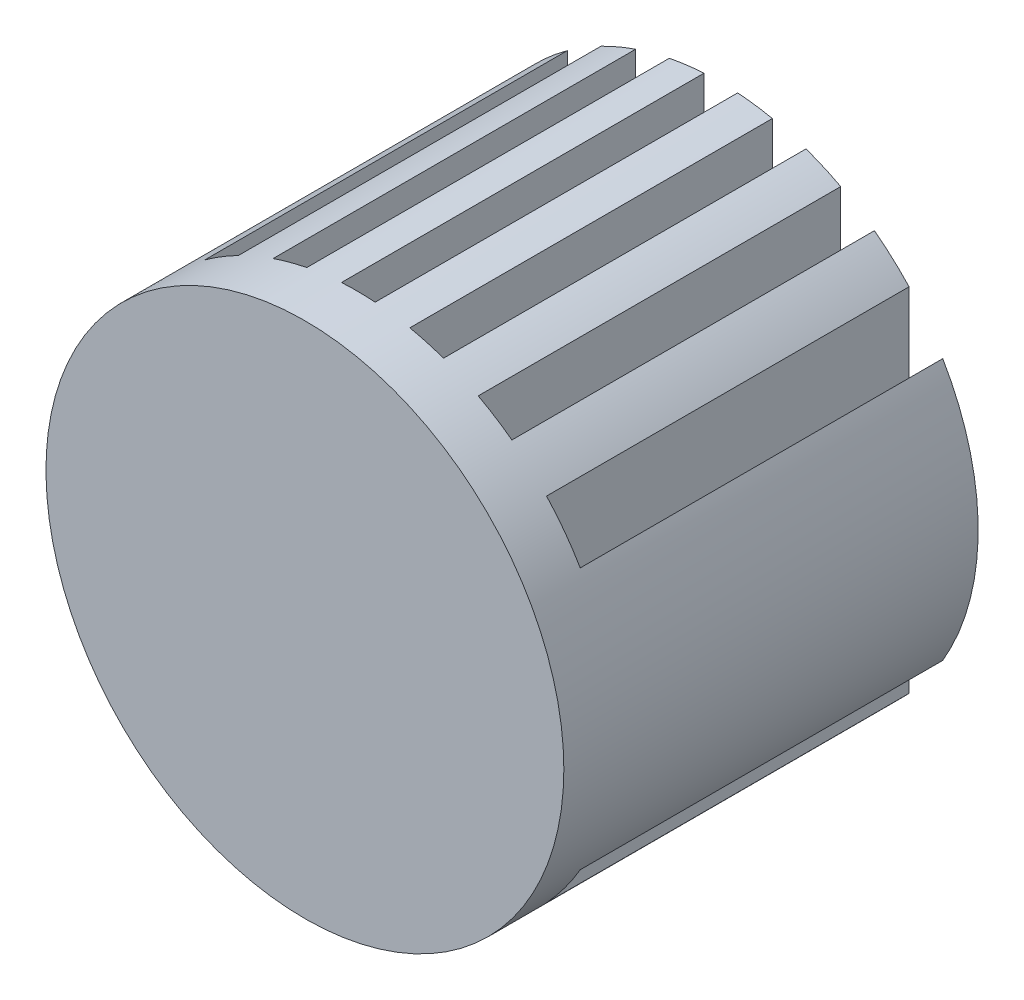
ISO-10303-21;
HEADER;
FILE_DESCRIPTION(('STEP AP214'),'2;1');
FILE_NAME('part.step','',(''),(''),'','','');
FILE_SCHEMA(('AUTOMOTIVE_DESIGN { 1 0 10303 214 1 1 1 1 }'));
ENDSEC;
DATA;
#1=APPLICATION_CONTEXT('core data for automotive mechanical design processes');
#2=APPLICATION_PROTOCOL_DEFINITION('international standard','automotive_design',2000,#1);
#3=PRODUCT_CONTEXT('',#1,'mechanical');
#4=PRODUCT('Part','Part','',(#3));
#5=PRODUCT_RELATED_PRODUCT_CATEGORY('part','',(#4));
#6=PRODUCT_DEFINITION_FORMATION('','',#4);
#7=PRODUCT_DEFINITION_CONTEXT('part definition',#1,'design');
#8=PRODUCT_DEFINITION('design','',#6,#7);
#9=PRODUCT_DEFINITION_SHAPE('','',#8);
#10=(LENGTH_UNIT() NAMED_UNIT(*) SI_UNIT(.MILLI.,.METRE.));
#11=(NAMED_UNIT(*) PLANE_ANGLE_UNIT() SI_UNIT($,.RADIAN.));
#12=(NAMED_UNIT(*) SI_UNIT($,.STERADIAN.) SOLID_ANGLE_UNIT());
#13=UNCERTAINTY_MEASURE_WITH_UNIT(LENGTH_MEASURE(1.E-05),#10,'distance_accuracy_value','');
#14=(GEOMETRIC_REPRESENTATION_CONTEXT(3) GLOBAL_UNCERTAINTY_ASSIGNED_CONTEXT((#13)) GLOBAL_UNIT_ASSIGNED_CONTEXT((#10,
#11,#12)) REPRESENTATION_CONTEXT('',''));
#15=CARTESIAN_POINT('',(0.,0.,0.));
#16=DIRECTION('',(0.,0.,1.));
#17=DIRECTION('',(1.,0.,0.));
#18=AXIS2_PLACEMENT_3D('',#15,#16,#17);
#19=CARTESIAN_POINT('',(0.,0.,0.));
#20=DIRECTION('',(0.,0.,1.));
#21=DIRECTION('',(1.,0.,0.));
#22=AXIS2_PLACEMENT_3D('',#19,#20,#21);
#23=PLANE('',#22);
#24=CARTESIAN_POINT('',(0.,0.,0.));
#25=DIRECTION('',(0.,0.,1.));
#26=DIRECTION('',(1.,0.,0.));
#27=AXIS2_PLACEMENT_3D('',#24,#25,#26);
#28=CIRCLE('',#27,31.75);
#29=CARTESIAN_POINT('',(27.40914,-16.0250286882863,0.));
#30=VERTEX_POINT('',#29);
#31=CARTESIAN_POINT('',(27.40914,16.0250286882863,0.));
#32=VERTEX_POINT('',#31);
#33=EDGE_CURVE('E261',#30,#32,#28,.T.);
#34=ORIENTED_EDGE('',*,*,#33,.F.);
#35=DIRECTION('',(0.,1.,0.));
#36=VECTOR('',#35,1.);
#37=CARTESIAN_POINT('',(27.40914,0.,0.));
#38=LINE('',#37,#36);
#39=EDGE_CURVE('E313',#30,#32,#38,.T.);
#40=ORIENTED_EDGE('',*,*,#39,.T.);
#41=EDGE_LOOP('',(#34,#40));
#42=FACE_BOUND('',#41,.T.);
#43=ADVANCED_FACE('F39',(#42),#23,.F.);
#44=CARTESIAN_POINT('',(14.8971,28.0381688344656,0.));
#45=VERTEX_POINT('',#44);
#46=CARTESIAN_POINT('',(10.64514,29.9122632774653,0.));
#47=VERTEX_POINT('',#46);
#48=EDGE_CURVE('E567',#45,#47,#28,.T.);
#49=ORIENTED_EDGE('',*,*,#48,.F.);
#50=DIRECTION('',(0.,-1.,0.));
#51=VECTOR('',#50,1.);
#52=CARTESIAN_POINT('',(14.8971,0.,0.));
#53=LINE('',#52,#51);
#54=CARTESIAN_POINT('',(14.8971,-28.0381688344656,0.));
#55=VERTEX_POINT('',#54);
#56=EDGE_CURVE('E306',#45,#55,#53,.T.);
#57=ORIENTED_EDGE('',*,*,#56,.T.);
#58=CARTESIAN_POINT('',(10.64514,-29.9122632774653,0.));
#59=VERTEX_POINT('',#58);
#60=EDGE_CURVE('E534',#59,#55,#28,.T.);
#61=ORIENTED_EDGE('',*,*,#60,.F.);
#62=DIRECTION('',(0.,1.,0.));
#63=VECTOR('',#62,1.);
#64=CARTESIAN_POINT('',(10.64514,0.,0.));
#65=LINE('',#64,#63);
#66=EDGE_CURVE('E294',#59,#47,#65,.T.);
#67=ORIENTED_EDGE('',*,*,#66,.T.);
#68=EDGE_LOOP('',(#49,#57,#61,#67));
#69=FACE_BOUND('',#68,.T.);
#70=ADVANCED_FACE('F605',(#69),#23,.F.);
#71=CARTESIAN_POINT('',(6.5151,31.074361972372,0.));
#72=VERTEX_POINT('',#71);
#73=CARTESIAN_POINT('',(2.26314,31.6692389763379,0.));
#74=VERTEX_POINT('',#73);
#75=EDGE_CURVE('E569',#72,#74,#28,.T.);
#76=ORIENTED_EDGE('',*,*,#75,.F.);
#77=DIRECTION('',(0.,-1.,0.));
#78=VECTOR('',#77,1.);
#79=CARTESIAN_POINT('',(6.51509999999999,0.,0.));
#80=LINE('',#79,#78);
#81=CARTESIAN_POINT('',(6.51509999999999,-31.074361972372,0.));
#82=VERTEX_POINT('',#81);
#83=EDGE_CURVE('E298',#72,#82,#80,.T.);
#84=ORIENTED_EDGE('',*,*,#83,.T.);
#85=CARTESIAN_POINT('',(2.26314,-31.6692389763379,0.));
#86=VERTEX_POINT('',#85);
#87=EDGE_CURVE('E537',#86,#82,#28,.T.);
#88=ORIENTED_EDGE('',*,*,#87,.F.);
#89=DIRECTION('',(0.,1.,0.));
#90=VECTOR('',#89,1.);
#91=CARTESIAN_POINT('',(2.26314,0.,0.));
#92=LINE('',#91,#90);
#93=EDGE_CURVE('E286',#86,#74,#92,.T.);
#94=ORIENTED_EDGE('',*,*,#93,.T.);
#95=EDGE_LOOP('',(#76,#84,#88,#94));
#96=FACE_BOUND('',#95,.T.);
#97=ADVANCED_FACE('F609',(#96),#23,.F.);
#98=CARTESIAN_POINT('',(-1.8669,31.6950656158021,0.));
#99=VERTEX_POINT('',#98);
#100=CARTESIAN_POINT('',(-6.11886,31.154807852086,0.));
#101=VERTEX_POINT('',#100);
#102=EDGE_CURVE('E549',#99,#101,#28,.T.);
#103=ORIENTED_EDGE('',*,*,#102,.F.);
#104=DIRECTION('',(0.,-1.,0.));
#105=VECTOR('',#104,1.);
#106=CARTESIAN_POINT('',(-1.86690000000001,0.,0.));
#107=LINE('',#106,#105);
#108=CARTESIAN_POINT('',(-1.86690000000001,-31.6950656158021,0.));
#109=VERTEX_POINT('',#108);
#110=EDGE_CURVE('E290',#99,#109,#107,.T.);
#111=ORIENTED_EDGE('',*,*,#110,.T.);
#112=CARTESIAN_POINT('',(-6.11886,-31.154807852086,0.));
#113=VERTEX_POINT('',#112);
#114=EDGE_CURVE('E260',#113,#109,#28,.T.);
#115=ORIENTED_EDGE('',*,*,#114,.F.);
#116=DIRECTION('',(0.,1.,0.));
#117=VECTOR('',#116,1.);
#118=CARTESIAN_POINT('',(-6.11886,0.,0.));
#119=LINE('',#118,#117);
#120=EDGE_CURVE('E278',#113,#101,#119,.T.);
#121=ORIENTED_EDGE('',*,*,#120,.T.);
#122=EDGE_LOOP('',(#103,#111,#115,#121));
#123=FACE_BOUND('',#122,.T.);
#124=ADVANCED_FACE('F547',(#123),#23,.F.);
#125=CARTESIAN_POINT('',(-10.2489,30.0503335886642,0.));
#126=VERTEX_POINT('',#125);
#127=CARTESIAN_POINT('',(-14.50086,28.2451333730326,0.));
#128=VERTEX_POINT('',#127);
#129=EDGE_CURVE('E572',#126,#128,#28,.T.);
#130=ORIENTED_EDGE('',*,*,#129,.F.);
#131=DIRECTION('',(0.,-1.,0.));
#132=VECTOR('',#131,1.);
#133=CARTESIAN_POINT('',(-10.2489,0.,0.));
#134=LINE('',#133,#132);
#135=CARTESIAN_POINT('',(-10.2489,-30.0503335886642,0.));
#136=VERTEX_POINT('',#135);
#137=EDGE_CURVE('E282',#126,#136,#134,.T.);
#138=ORIENTED_EDGE('',*,*,#137,.T.);
#139=CARTESIAN_POINT('',(-14.50086,-28.2451333730326,0.));
#140=VERTEX_POINT('',#139);
#141=EDGE_CURVE('E253',#140,#136,#28,.T.);
#142=ORIENTED_EDGE('',*,*,#141,.F.);
#143=DIRECTION('',(0.,1.,0.));
#144=VECTOR('',#143,1.);
#145=CARTESIAN_POINT('',(-14.50086,0.,0.));
#146=LINE('',#145,#144);
#147=EDGE_CURVE('E272',#140,#128,#146,.T.);
#148=ORIENTED_EDGE('',*,*,#147,.T.);
#149=EDGE_LOOP('',(#130,#138,#142,#148));
#150=FACE_BOUND('',#149,.T.);
#151=ADVANCED_FACE('F585',(#150),#23,.F.);
#152=CARTESIAN_POINT('',(-18.6309,25.708988023452,0.));
#153=VERTEX_POINT('',#152);
#154=CARTESIAN_POINT('',(-22.88286,22.0099345346687,0.));
#155=VERTEX_POINT('',#154);
#156=EDGE_CURVE('E258',#153,#155,#28,.T.);
#157=ORIENTED_EDGE('',*,*,#156,.F.);
#158=DIRECTION('',(0.,-1.,0.));
#159=VECTOR('',#158,1.);
#160=CARTESIAN_POINT('',(-18.6309,0.,0.));
#161=LINE('',#160,#159);
#162=CARTESIAN_POINT('',(-18.6309,-25.708988023452,0.));
#163=VERTEX_POINT('',#162);
#164=EDGE_CURVE('E250',#153,#163,#161,.T.);
#165=ORIENTED_EDGE('',*,*,#164,.T.);
#166=CARTESIAN_POINT('',(-22.88286,-22.0099345346687,0.));
#167=VERTEX_POINT('',#166);
#168=EDGE_CURVE('E242',#167,#163,#28,.T.);
#169=ORIENTED_EDGE('',*,*,#168,.F.);
#170=DIRECTION('',(0.,1.,0.));
#171=VECTOR('',#170,1.);
#172=CARTESIAN_POINT('',(-22.88286,0.,0.));
#173=LINE('',#172,#171);
#174=EDGE_CURVE('E223',#167,#155,#173,.T.);
#175=ORIENTED_EDGE('',*,*,#174,.T.);
#176=EDGE_LOOP('',(#157,#165,#169,#175));
#177=FACE_BOUND('',#176,.T.);
#178=ADVANCED_FACE('F249',(#177),#23,.F.);
#179=CARTESIAN_POINT('',(-27.0129,16.6842960172133,0.));
#180=VERTEX_POINT('',#179);
#181=CARTESIAN_POINT('',(-27.0129,-16.6842960172133,0.));
#182=VERTEX_POINT('',#181);
#183=EDGE_CURVE('E252',#180,#182,#28,.T.);
#184=ORIENTED_EDGE('',*,*,#183,.F.);
#185=DIRECTION('',(0.,-1.,0.));
#186=VECTOR('',#185,1.);
#187=CARTESIAN_POINT('',(-27.0129,0.,0.));
#188=LINE('',#187,#186);
#189=EDGE_CURVE('E233',#180,#182,#188,.T.);
#190=ORIENTED_EDGE('',*,*,#189,.T.);
#191=EDGE_LOOP('',(#184,#190));
#192=FACE_BOUND('',#191,.T.);
#193=ADVANCED_FACE('F615',(#192),#23,.F.);
#194=CARTESIAN_POINT('',(0.,0.,50.8));
#195=DIRECTION('',(0.,0.,-1.));
#196=DIRECTION('',(-1.,0.,0.));
#197=AXIS2_PLACEMENT_3D('',#194,#195,#196);
#198=CYLINDRICAL_SURFACE('',#197,31.75);
#199=ORIENTED_EDGE('',*,*,#33,.T.);
#200=DIRECTION('',(0.,0.,-1.));
#201=VECTOR('',#200,1.);
#202=CARTESIAN_POINT('',(27.40914,16.0250286882863,50.8));
#203=LINE('',#202,#201);
#204=CARTESIAN_POINT('',(27.40914,16.0250286882863,44.45));
#205=VERTEX_POINT('',#204);
#206=EDGE_CURVE('E494',#32,#205,#203,.F.);
#207=ORIENTED_EDGE('',*,*,#206,.T.);
#208=CARTESIAN_POINT('',(0.,0.,44.45));
#209=DIRECTION('',(0.,0.,-1.));
#210=DIRECTION('',(-1.,0.,0.));
#211=AXIS2_PLACEMENT_3D('',#208,#209,#210);
#212=CIRCLE('',#211,31.75);
#213=CARTESIAN_POINT('',(23.2791,21.5904146136659,44.45));
#214=VERTEX_POINT('',#213);
#215=EDGE_CURVE('E11',#214,#205,#212,.T.);
#216=ORIENTED_EDGE('',*,*,#215,.F.);
#217=DIRECTION('',(0.,0.,-1.));
#218=VECTOR('',#217,1.);
#219=CARTESIAN_POINT('',(23.2791,21.5904146136659,50.8));
#220=LINE('',#219,#218);
#221=CARTESIAN_POINT('',(23.2791,21.5904146136659,0.));
#222=VERTEX_POINT('',#221);
#223=EDGE_CURVE('E490',#214,#222,#220,.T.);
#224=ORIENTED_EDGE('',*,*,#223,.T.);
#225=CARTESIAN_POINT('',(19.02714,25.4171289373997,0.));
#226=VERTEX_POINT('',#225);
#227=EDGE_CURVE('E266',#222,#226,#28,.T.);
#228=ORIENTED_EDGE('',*,*,#227,.T.);
#229=DIRECTION('',(0.,0.,-1.));
#230=VECTOR('',#229,1.);
#231=CARTESIAN_POINT('',(19.02714,25.4171289373997,50.8));
#232=LINE('',#231,#230);
#233=CARTESIAN_POINT('',(19.02714,25.4171289373997,44.45));
#234=VERTEX_POINT('',#233);
#235=EDGE_CURVE('E474',#226,#234,#232,.F.);
#236=ORIENTED_EDGE('',*,*,#235,.T.);
#237=CARTESIAN_POINT('',(0.,0.,44.45));
#238=DIRECTION('',(0.,0.,1.));
#239=DIRECTION('',(1.,0.,0.));
#240=AXIS2_PLACEMENT_3D('',#237,#238,#239);
#241=CIRCLE('',#240,31.75);
#242=CARTESIAN_POINT('',(14.8971,28.0381688344656,44.45));
#243=VERTEX_POINT('',#242);
#244=EDGE_CURVE('E342',#234,#243,#241,.T.);
#245=ORIENTED_EDGE('',*,*,#244,.T.);
#246=DIRECTION('',(0.,0.,-1.));
#247=VECTOR('',#246,1.);
#248=CARTESIAN_POINT('',(14.8971,28.0381688344656,50.8));
#249=LINE('',#248,#247);
#250=EDGE_CURVE('E484',#243,#45,#249,.T.);
#251=ORIENTED_EDGE('',*,*,#250,.T.);
#252=ORIENTED_EDGE('',*,*,#48,.T.);
#253=DIRECTION('',(0.,0.,-1.));
#254=VECTOR('',#253,1.);
#255=CARTESIAN_POINT('',(10.64514,29.9122632774653,50.8));
#256=LINE('',#255,#254);
#257=CARTESIAN_POINT('',(10.64514,29.9122632774653,44.45));
#258=VERTEX_POINT('',#257);
#259=EDGE_CURVE('E355',#47,#258,#256,.F.);
#260=ORIENTED_EDGE('',*,*,#259,.T.);
#261=CARTESIAN_POINT('',(0.,0.,44.45));
#262=DIRECTION('',(0.,0.,1.));
#263=DIRECTION('',(1.,0.,0.));
#264=AXIS2_PLACEMENT_3D('',#261,#262,#263);
#265=CIRCLE('',#264,31.75);
#266=CARTESIAN_POINT('',(6.5151,31.074361972372,44.45));
#267=VERTEX_POINT('',#266);
#268=EDGE_CURVE('E338',#258,#267,#265,.T.);
#269=ORIENTED_EDGE('',*,*,#268,.T.);
#270=DIRECTION('',(0.,0.,-1.));
#271=VECTOR('',#270,1.);
#272=CARTESIAN_POINT('',(6.5151,31.074361972372,50.8));
#273=LINE('',#272,#271);
#274=EDGE_CURVE('E352',#267,#72,#273,.T.);
#275=ORIENTED_EDGE('',*,*,#274,.T.);
#276=ORIENTED_EDGE('',*,*,#75,.T.);
#277=DIRECTION('',(0.,0.,-1.));
#278=VECTOR('',#277,1.);
#279=CARTESIAN_POINT('',(2.26314,31.6692389763379,50.8));
#280=LINE('',#279,#278);
#281=CARTESIAN_POINT('',(2.26314,31.6692389763379,44.45));
#282=VERTEX_POINT('',#281);
#283=EDGE_CURVE('E448',#74,#282,#280,.F.);
#284=ORIENTED_EDGE('',*,*,#283,.T.);
#285=CARTESIAN_POINT('',(0.,0.,44.45));
#286=DIRECTION('',(0.,0.,1.));
#287=DIRECTION('',(1.,0.,0.));
#288=AXIS2_PLACEMENT_3D('',#285,#286,#287);
#289=CIRCLE('',#288,31.75);
#290=CARTESIAN_POINT('',(-1.8669,31.6950656158021,44.45));
#291=VERTEX_POINT('',#290);
#292=EDGE_CURVE('E334',#282,#291,#289,.T.);
#293=ORIENTED_EDGE('',*,*,#292,.T.);
#294=DIRECTION('',(0.,0.,-1.));
#295=VECTOR('',#294,1.);
#296=CARTESIAN_POINT('',(-1.8669,31.6950656158021,50.8));
#297=LINE('',#296,#295);
#298=EDGE_CURVE('E460',#291,#99,#297,.T.);
#299=ORIENTED_EDGE('',*,*,#298,.T.);
#300=ORIENTED_EDGE('',*,*,#102,.T.);
#301=DIRECTION('',(0.,0.,-1.));
#302=VECTOR('',#301,1.);
#303=CARTESIAN_POINT('',(-6.11886,31.154807852086,50.8));
#304=LINE('',#303,#302);
#305=CARTESIAN_POINT('',(-6.11886,31.154807852086,44.45));
#306=VERTEX_POINT('',#305);
#307=EDGE_CURVE('E432',#101,#306,#304,.F.);
#308=ORIENTED_EDGE('',*,*,#307,.T.);
#309=CARTESIAN_POINT('',(0.,0.,44.45));
#310=DIRECTION('',(0.,0.,1.));
#311=DIRECTION('',(1.,0.,0.));
#312=AXIS2_PLACEMENT_3D('',#309,#310,#311);
#313=CIRCLE('',#312,31.75);
#314=CARTESIAN_POINT('',(-10.2489,30.0503335886642,44.45));
#315=VERTEX_POINT('',#314);
#316=EDGE_CURVE('E329',#306,#315,#313,.T.);
#317=ORIENTED_EDGE('',*,*,#316,.T.);
#318=DIRECTION('',(0.,0.,-1.));
#319=VECTOR('',#318,1.);
#320=CARTESIAN_POINT('',(-10.2489,30.0503335886642,50.8));
#321=LINE('',#320,#319);
#322=EDGE_CURVE('E444',#315,#126,#321,.T.);
#323=ORIENTED_EDGE('',*,*,#322,.T.);
#324=ORIENTED_EDGE('',*,*,#129,.T.);
#325=DIRECTION('',(0.,0.,-1.));
#326=VECTOR('',#325,1.);
#327=CARTESIAN_POINT('',(-14.50086,28.2451333730326,50.8));
#328=LINE('',#327,#326);
#329=CARTESIAN_POINT('',(-14.50086,28.2451333730326,44.45));
#330=VERTEX_POINT('',#329);
#331=EDGE_CURVE('E417',#128,#330,#328,.F.);
#332=ORIENTED_EDGE('',*,*,#331,.T.);
#333=CARTESIAN_POINT('',(0.,0.,44.45));
#334=DIRECTION('',(0.,0.,1.));
#335=DIRECTION('',(1.,0.,0.));
#336=AXIS2_PLACEMENT_3D('',#333,#334,#335);
#337=CIRCLE('',#336,31.75);
#338=CARTESIAN_POINT('',(-18.6309,25.708988023452,44.45));
#339=VERTEX_POINT('',#338);
#340=EDGE_CURVE('E324',#330,#339,#337,.T.);
#341=ORIENTED_EDGE('',*,*,#340,.T.);
#342=DIRECTION('',(0.,0.,-1.));
#343=VECTOR('',#342,1.);
#344=CARTESIAN_POINT('',(-18.6309,25.708988023452,50.8));
#345=LINE('',#344,#343);
#346=EDGE_CURVE('E428',#339,#153,#345,.T.);
#347=ORIENTED_EDGE('',*,*,#346,.T.);
#348=ORIENTED_EDGE('',*,*,#156,.T.);
#349=DIRECTION('',(0.,0.,-1.));
#350=VECTOR('',#349,1.);
#351=CARTESIAN_POINT('',(-22.88286,22.0099345346687,50.8));
#352=LINE('',#351,#350);
#353=CARTESIAN_POINT('',(-22.88286,22.0099345346687,44.45));
#354=VERTEX_POINT('',#353);
#355=EDGE_CURVE('E63',#155,#354,#352,.F.);
#356=ORIENTED_EDGE('',*,*,#355,.T.);
#357=CARTESIAN_POINT('',(0.,0.,44.45));
#358=DIRECTION('',(0.,0.,1.));
#359=DIRECTION('',(1.,0.,0.));
#360=AXIS2_PLACEMENT_3D('',#357,#358,#359);
#361=CIRCLE('',#360,31.75);
#362=CARTESIAN_POINT('',(-27.0129,16.6842960172133,44.45));
#363=VERTEX_POINT('',#362);
#364=EDGE_CURVE('E319',#354,#363,#361,.T.);
#365=ORIENTED_EDGE('',*,*,#364,.T.);
#366=DIRECTION('',(0.,0.,-1.));
#367=VECTOR('',#366,1.);
#368=CARTESIAN_POINT('',(-27.0129,16.6842960172133,50.8));
#369=LINE('',#368,#367);
#370=EDGE_CURVE('E413',#363,#180,#369,.T.);
#371=ORIENTED_EDGE('',*,*,#370,.T.);
#372=ORIENTED_EDGE('',*,*,#183,.T.);
#373=DIRECTION('',(0.,0.,-1.));
#374=VECTOR('',#373,1.);
#375=CARTESIAN_POINT('',(-27.0129,-16.6842960172133,50.8));
#376=LINE('',#375,#374);
#377=CARTESIAN_POINT('',(-27.0129,-16.6842960172133,44.45));
#378=VERTEX_POINT('',#377);
#379=EDGE_CURVE('E246',#182,#378,#376,.F.);
#380=ORIENTED_EDGE('',*,*,#379,.T.);
#381=CARTESIAN_POINT('',(-22.88286,-22.0099345346687,44.45));
#382=VERTEX_POINT('',#381);
#383=EDGE_CURVE('E244',#378,#382,#361,.T.);
#384=ORIENTED_EDGE('',*,*,#383,.T.);
#385=DIRECTION('',(0.,0.,-1.));
#386=VECTOR('',#385,1.);
#387=CARTESIAN_POINT('',(-22.88286,-22.0099345346687,50.8));
#388=LINE('',#387,#386);
#389=EDGE_CURVE('E226',#382,#167,#388,.T.);
#390=ORIENTED_EDGE('',*,*,#389,.T.);
#391=ORIENTED_EDGE('',*,*,#168,.T.);
#392=DIRECTION('',(0.,0.,-1.));
#393=VECTOR('',#392,1.);
#394=CARTESIAN_POINT('',(-18.6309,-25.708988023452,50.8));
#395=LINE('',#394,#393);
#396=CARTESIAN_POINT('',(-18.6309,-25.708988023452,44.45));
#397=VERTEX_POINT('',#396);
#398=EDGE_CURVE('E425',#163,#397,#395,.F.);
#399=ORIENTED_EDGE('',*,*,#398,.T.);
#400=CARTESIAN_POINT('',(-14.50086,-28.2451333730326,44.45));
#401=VERTEX_POINT('',#400);
#402=EDGE_CURVE('E320',#397,#401,#337,.T.);
#403=ORIENTED_EDGE('',*,*,#402,.T.);
#404=DIRECTION('',(0.,0.,-1.));
#405=VECTOR('',#404,1.);
#406=CARTESIAN_POINT('',(-14.50086,-28.2451333730326,50.8));
#407=LINE('',#406,#405);
#408=EDGE_CURVE('E421',#401,#140,#407,.T.);
#409=ORIENTED_EDGE('',*,*,#408,.T.);
#410=ORIENTED_EDGE('',*,*,#141,.T.);
#411=DIRECTION('',(0.,0.,-1.));
#412=VECTOR('',#411,1.);
#413=CARTESIAN_POINT('',(-10.2489,-30.0503335886642,50.8));
#414=LINE('',#413,#412);
#415=CARTESIAN_POINT('',(-10.2489,-30.0503335886642,44.45));
#416=VERTEX_POINT('',#415);
#417=EDGE_CURVE('E440',#136,#416,#414,.F.);
#418=ORIENTED_EDGE('',*,*,#417,.T.);
#419=CARTESIAN_POINT('',(-6.11886,-31.154807852086,44.45));
#420=VERTEX_POINT('',#419);
#421=EDGE_CURVE('E325',#416,#420,#313,.T.);
#422=ORIENTED_EDGE('',*,*,#421,.T.);
#423=DIRECTION('',(0.,0.,-1.));
#424=VECTOR('',#423,1.);
#425=CARTESIAN_POINT('',(-6.11886,-31.154807852086,50.8));
#426=LINE('',#425,#424);
#427=EDGE_CURVE('E436',#420,#113,#426,.T.);
#428=ORIENTED_EDGE('',*,*,#427,.T.);
#429=ORIENTED_EDGE('',*,*,#114,.T.);
#430=DIRECTION('',(0.,0.,-1.));
#431=VECTOR('',#430,1.);
#432=CARTESIAN_POINT('',(-1.86690000000001,-31.6950656158021,50.8));
#433=LINE('',#432,#431);
#434=CARTESIAN_POINT('',(-1.86690000000001,-31.6950656158021,44.45));
#435=VERTEX_POINT('',#434);
#436=EDGE_CURVE('E456',#109,#435,#433,.F.);
#437=ORIENTED_EDGE('',*,*,#436,.T.);
#438=CARTESIAN_POINT('',(2.26314,-31.6692389763379,44.45));
#439=VERTEX_POINT('',#438);
#440=EDGE_CURVE('E330',#435,#439,#289,.T.);
#441=ORIENTED_EDGE('',*,*,#440,.T.);
#442=DIRECTION('',(0.,0.,-1.));
#443=VECTOR('',#442,1.);
#444=CARTESIAN_POINT('',(2.26314,-31.6692389763379,50.8));
#445=LINE('',#444,#443);
#446=EDGE_CURVE('E452',#439,#86,#445,.T.);
#447=ORIENTED_EDGE('',*,*,#446,.T.);
#448=ORIENTED_EDGE('',*,*,#87,.T.);
#449=DIRECTION('',(0.,0.,-1.));
#450=VECTOR('',#449,1.);
#451=CARTESIAN_POINT('',(6.51509999999999,-31.074361972372,50.8));
#452=LINE('',#451,#450);
#453=CARTESIAN_POINT('',(6.51509999999999,-31.074361972372,44.45));
#454=VERTEX_POINT('',#453);
#455=EDGE_CURVE('E468',#82,#454,#452,.F.);
#456=ORIENTED_EDGE('',*,*,#455,.T.);
#457=CARTESIAN_POINT('',(10.64514,-29.9122632774653,44.45));
#458=VERTEX_POINT('',#457);
#459=EDGE_CURVE('E335',#454,#458,#265,.T.);
#460=ORIENTED_EDGE('',*,*,#459,.T.);
#461=DIRECTION('',(0.,0.,-1.));
#462=VECTOR('',#461,1.);
#463=CARTESIAN_POINT('',(10.64514,-29.9122632774653,50.8));
#464=LINE('',#463,#462);
#465=EDGE_CURVE('E367',#458,#59,#464,.T.);
#466=ORIENTED_EDGE('',*,*,#465,.T.);
#467=ORIENTED_EDGE('',*,*,#60,.T.);
#468=DIRECTION('',(0.,0.,-1.));
#469=VECTOR('',#468,1.);
#470=CARTESIAN_POINT('',(14.8971,-28.0381688344656,50.8));
#471=LINE('',#470,#469);
#472=CARTESIAN_POINT('',(14.8971,-28.0381688344656,44.45));
#473=VERTEX_POINT('',#472);
#474=EDGE_CURVE('E481',#55,#473,#471,.F.);
#475=ORIENTED_EDGE('',*,*,#474,.T.);
#476=CARTESIAN_POINT('',(19.02714,-25.4171289373997,44.45));
#477=VERTEX_POINT('',#476);
#478=EDGE_CURVE('E339',#473,#477,#241,.T.);
#479=ORIENTED_EDGE('',*,*,#478,.T.);
#480=DIRECTION('',(0.,0.,-1.));
#481=VECTOR('',#480,1.);
#482=CARTESIAN_POINT('',(19.02714,-25.4171289373997,50.8));
#483=LINE('',#482,#481);
#484=CARTESIAN_POINT('',(19.02714,-25.4171289373997,0.));
#485=VERTEX_POINT('',#484);
#486=EDGE_CURVE('E478',#477,#485,#483,.T.);
#487=ORIENTED_EDGE('',*,*,#486,.T.);
#488=CARTESIAN_POINT('',(23.2791,-21.590414613666,0.));
#489=VERTEX_POINT('',#488);
#490=EDGE_CURVE('E264',#485,#489,#28,.T.);
#491=ORIENTED_EDGE('',*,*,#490,.T.);
#492=DIRECTION('',(0.,0.,-1.));
#493=VECTOR('',#492,1.);
#494=CARTESIAN_POINT('',(23.2791,-21.590414613666,50.8));
#495=LINE('',#494,#493);
#496=CARTESIAN_POINT('',(23.2791,-21.590414613666,44.45));
#497=VERTEX_POINT('',#496);
#498=EDGE_CURVE('E55',#489,#497,#495,.F.);
#499=ORIENTED_EDGE('',*,*,#498,.T.);
#500=CARTESIAN_POINT('',(27.40914,-16.0250286882863,44.45));
#501=VERTEX_POINT('',#500);
#502=EDGE_CURVE('E43',#501,#497,#212,.T.);
#503=ORIENTED_EDGE('',*,*,#502,.F.);
#504=DIRECTION('',(0.,0.,-1.));
#505=VECTOR('',#504,1.);
#506=CARTESIAN_POINT('',(27.40914,-16.0250286882863,50.8));
#507=LINE('',#506,#505);
#508=EDGE_CURVE('E265',#501,#30,#507,.T.);
#509=ORIENTED_EDGE('',*,*,#508,.T.);
#510=EDGE_LOOP('',(#199,#207,#216,#224,#228,#236,#245,#251,#252,#260,#269,#275,#276,#284,#293,
#299,#300,#308,#317,#323,#324,#332,#341,#347,#348,#356,#365,#371,#372,#380,#384,#390,#391,#399,
#403,#409,#410,#418,#422,#428,#429,#437,#441,#447,#448,#456,#460,#466,#467,#475,#479,#487,#491,
#499,#503,#509));
#511=FACE_BOUND('',#510,.T.);
#512=CARTESIAN_POINT('',(0.,0.,50.8));
#513=DIRECTION('',(0.,0.,1.));
#514=DIRECTION('',(1.,0.,0.));
#515=AXIS2_PLACEMENT_3D('',#512,#513,#514);
#516=CIRCLE('',#515,31.75);
#517=CARTESIAN_POINT('',(31.75,0.,50.8));
#518=VERTEX_POINT('',#517);
#519=EDGE_CURVE('E234',#518,#518,#516,.T.);
#520=ORIENTED_EDGE('',*,*,#519,.F.);
#521=EDGE_LOOP('',(#520));
#522=FACE_BOUND('',#521,.T.);
#523=ADVANCED_FACE('F41',(#511,#522),#198,.T.);
#524=CARTESIAN_POINT('',(0.,0.,50.8));
#525=DIRECTION('',(0.,0.,1.));
#526=DIRECTION('',(1.,0.,0.));
#527=AXIS2_PLACEMENT_3D('',#524,#525,#526);
#528=PLANE('',#527);
#529=ORIENTED_EDGE('',*,*,#519,.T.);
#530=EDGE_LOOP('',(#529));
#531=FACE_BOUND('',#530,.T.);
#532=ADVANCED_FACE('F614',(#531),#528,.T.);
#533=ORIENTED_EDGE('',*,*,#227,.F.);
#534=DIRECTION('',(0.,-1.,0.));
#535=VECTOR('',#534,1.);
#536=CARTESIAN_POINT('',(23.2791,0.,0.));
#537=LINE('',#536,#535);
#538=EDGE_CURVE('E310',#222,#489,#537,.T.);
#539=ORIENTED_EDGE('',*,*,#538,.T.);
#540=ORIENTED_EDGE('',*,*,#490,.F.);
#541=DIRECTION('',(0.,1.,0.));
#542=VECTOR('',#541,1.);
#543=CARTESIAN_POINT('',(19.02714,0.,0.));
#544=LINE('',#543,#542);
#545=EDGE_CURVE('E302',#485,#226,#544,.T.);
#546=ORIENTED_EDGE('',*,*,#545,.T.);
#547=EDGE_LOOP('',(#533,#539,#540,#546));
#548=FACE_BOUND('',#547,.T.);
#549=ADVANCED_FACE('F531',(#548),#23,.F.);
#550=CARTESIAN_POINT('',(0.,0.,44.45));
#551=DIRECTION('',(0.,0.,1.));
#552=DIRECTION('',(1.,0.,0.));
#553=AXIS2_PLACEMENT_3D('',#550,#551,#552);
#554=PLANE('',#553);
#555=DIRECTION('',(0.,-1.,0.));
#556=VECTOR('',#555,1.);
#557=CARTESIAN_POINT('',(-22.88286,31.75,44.45));
#558=LINE('',#557,#556);
#559=EDGE_CURVE('E402',#354,#382,#558,.T.);
#560=ORIENTED_EDGE('',*,*,#559,.T.);
#561=ORIENTED_EDGE('',*,*,#383,.F.);
#562=DIRECTION('',(0.,1.,0.));
#563=VECTOR('',#562,1.);
#564=CARTESIAN_POINT('',(-27.0129,31.75,44.45));
#565=LINE('',#564,#563);
#566=EDGE_CURVE('E398',#378,#363,#565,.T.);
#567=ORIENTED_EDGE('',*,*,#566,.T.);
#568=ORIENTED_EDGE('',*,*,#364,.F.);
#569=EDGE_LOOP('',(#560,#561,#567,#568));
#570=FACE_BOUND('',#569,.T.);
#571=ADVANCED_FACE('F613',(#570),#554,.F.);
#572=CARTESIAN_POINT('',(-27.0129,31.75,44.45));
#573=DIRECTION('',(-1.,0.,0.));
#574=DIRECTION('',(0.,-1.,0.));
#575=AXIS2_PLACEMENT_3D('',#572,#573,#574);
#576=PLANE('',#575);
#577=ORIENTED_EDGE('',*,*,#566,.F.);
#578=ORIENTED_EDGE('',*,*,#379,.F.);
#579=ORIENTED_EDGE('',*,*,#189,.F.);
#580=ORIENTED_EDGE('',*,*,#370,.F.);
#581=EDGE_LOOP('',(#577,#578,#579,#580));
#582=FACE_BOUND('',#581,.T.);
#583=ADVANCED_FACE('F620',(#582),#576,.F.);
#584=CARTESIAN_POINT('',(-22.88286,31.75,44.45));
#585=DIRECTION('',(1.,0.,0.));
#586=DIRECTION('',(0.,1.,0.));
#587=AXIS2_PLACEMENT_3D('',#584,#585,#586);
#588=PLANE('',#587);
#589=ORIENTED_EDGE('',*,*,#559,.F.);
#590=ORIENTED_EDGE('',*,*,#355,.F.);
#591=ORIENTED_EDGE('',*,*,#174,.F.);
#592=ORIENTED_EDGE('',*,*,#389,.F.);
#593=EDGE_LOOP('',(#589,#590,#591,#592));
#594=FACE_BOUND('',#593,.T.);
#595=ADVANCED_FACE('F225',(#594),#588,.F.);
#596=CARTESIAN_POINT('',(0.,0.,44.45));
#597=DIRECTION('',(0.,0.,1.));
#598=DIRECTION('',(1.,0.,0.));
#599=AXIS2_PLACEMENT_3D('',#596,#597,#598);
#600=PLANE('',#599);
#601=DIRECTION('',(0.,-1.,0.));
#602=VECTOR('',#601,1.);
#603=CARTESIAN_POINT('',(-14.50086,31.75,44.45));
#604=LINE('',#603,#602);
#605=EDGE_CURVE('E394',#330,#401,#604,.T.);
#606=ORIENTED_EDGE('',*,*,#605,.T.);
#607=ORIENTED_EDGE('',*,*,#402,.F.);
#608=DIRECTION('',(0.,1.,0.));
#609=VECTOR('',#608,1.);
#610=CARTESIAN_POINT('',(-18.6309,31.75,44.45));
#611=LINE('',#610,#609);
#612=EDGE_CURVE('E390',#397,#339,#611,.T.);
#613=ORIENTED_EDGE('',*,*,#612,.T.);
#614=ORIENTED_EDGE('',*,*,#340,.F.);
#615=EDGE_LOOP('',(#606,#607,#613,#614));
#616=FACE_BOUND('',#615,.T.);
#617=ADVANCED_FACE('F579',(#616),#600,.F.);
#618=CARTESIAN_POINT('',(-18.6309,31.75,44.45));
#619=DIRECTION('',(-1.,0.,0.));
#620=DIRECTION('',(0.,-1.,0.));
#621=AXIS2_PLACEMENT_3D('',#618,#619,#620);
#622=PLANE('',#621);
#623=ORIENTED_EDGE('',*,*,#612,.F.);
#624=ORIENTED_EDGE('',*,*,#398,.F.);
#625=ORIENTED_EDGE('',*,*,#164,.F.);
#626=ORIENTED_EDGE('',*,*,#346,.F.);
#627=EDGE_LOOP('',(#623,#624,#625,#626));
#628=FACE_BOUND('',#627,.T.);
#629=ADVANCED_FACE('F577',(#628),#622,.F.);
#630=CARTESIAN_POINT('',(-14.50086,31.75,44.45));
#631=DIRECTION('',(1.,0.,0.));
#632=DIRECTION('',(0.,1.,0.));
#633=AXIS2_PLACEMENT_3D('',#630,#631,#632);
#634=PLANE('',#633);
#635=ORIENTED_EDGE('',*,*,#605,.F.);
#636=ORIENTED_EDGE('',*,*,#331,.F.);
#637=ORIENTED_EDGE('',*,*,#147,.F.);
#638=ORIENTED_EDGE('',*,*,#408,.F.);
#639=EDGE_LOOP('',(#635,#636,#637,#638));
#640=FACE_BOUND('',#639,.T.);
#641=ADVANCED_FACE('F640',(#640),#634,.F.);
#642=CARTESIAN_POINT('',(0.,0.,44.45));
#643=DIRECTION('',(0.,0.,1.));
#644=DIRECTION('',(1.,0.,0.));
#645=AXIS2_PLACEMENT_3D('',#642,#643,#644);
#646=PLANE('',#645);
#647=DIRECTION('',(0.,-1.,0.));
#648=VECTOR('',#647,1.);
#649=CARTESIAN_POINT('',(-6.11886,31.75,44.45));
#650=LINE('',#649,#648);
#651=EDGE_CURVE('E386',#306,#420,#650,.T.);
#652=ORIENTED_EDGE('',*,*,#651,.T.);
#653=ORIENTED_EDGE('',*,*,#421,.F.);
#654=DIRECTION('',(0.,1.,0.));
#655=VECTOR('',#654,1.);
#656=CARTESIAN_POINT('',(-10.2489,31.75,44.45));
#657=LINE('',#656,#655);
#658=EDGE_CURVE('E384',#416,#315,#657,.T.);
#659=ORIENTED_EDGE('',*,*,#658,.T.);
#660=ORIENTED_EDGE('',*,*,#316,.F.);
#661=EDGE_LOOP('',(#652,#653,#659,#660));
#662=FACE_BOUND('',#661,.T.);
#663=ADVANCED_FACE('F591',(#662),#646,.F.);
#664=CARTESIAN_POINT('',(-10.2489,31.75,44.45));
#665=DIRECTION('',(-1.,0.,0.));
#666=DIRECTION('',(0.,-1.,0.));
#667=AXIS2_PLACEMENT_3D('',#664,#665,#666);
#668=PLANE('',#667);
#669=ORIENTED_EDGE('',*,*,#658,.F.);
#670=ORIENTED_EDGE('',*,*,#417,.F.);
#671=ORIENTED_EDGE('',*,*,#137,.F.);
#672=ORIENTED_EDGE('',*,*,#322,.F.);
#673=EDGE_LOOP('',(#669,#670,#671,#672));
#674=FACE_BOUND('',#673,.T.);
#675=ADVANCED_FACE('F588',(#674),#668,.F.);
#676=CARTESIAN_POINT('',(-6.11886,31.75,44.45));
#677=DIRECTION('',(1.,0.,0.));
#678=DIRECTION('',(0.,1.,0.));
#679=AXIS2_PLACEMENT_3D('',#676,#677,#678);
#680=PLANE('',#679);
#681=ORIENTED_EDGE('',*,*,#651,.F.);
#682=ORIENTED_EDGE('',*,*,#307,.F.);
#683=ORIENTED_EDGE('',*,*,#120,.F.);
#684=ORIENTED_EDGE('',*,*,#427,.F.);
#685=EDGE_LOOP('',(#681,#682,#683,#684));
#686=FACE_BOUND('',#685,.T.);
#687=ADVANCED_FACE('F593',(#686),#680,.F.);
#688=CARTESIAN_POINT('',(0.,0.,44.45));
#689=DIRECTION('',(0.,0.,1.));
#690=DIRECTION('',(1.,0.,0.));
#691=AXIS2_PLACEMENT_3D('',#688,#689,#690);
#692=PLANE('',#691);
#693=DIRECTION('',(0.,-1.,0.));
#694=VECTOR('',#693,1.);
#695=CARTESIAN_POINT('',(2.26314,31.75,44.45));
#696=LINE('',#695,#694);
#697=EDGE_CURVE('E376',#282,#439,#696,.T.);
#698=ORIENTED_EDGE('',*,*,#697,.T.);
#699=ORIENTED_EDGE('',*,*,#440,.F.);
#700=DIRECTION('',(0.,1.,0.));
#701=VECTOR('',#700,1.);
#702=CARTESIAN_POINT('',(-1.8669,31.75,44.45));
#703=LINE('',#702,#701);
#704=EDGE_CURVE('E369',#435,#291,#703,.T.);
#705=ORIENTED_EDGE('',*,*,#704,.T.);
#706=ORIENTED_EDGE('',*,*,#292,.F.);
#707=EDGE_LOOP('',(#698,#699,#705,#706));
#708=FACE_BOUND('',#707,.T.);
#709=ADVANCED_FACE('F595',(#708),#692,.F.);
#710=CARTESIAN_POINT('',(-1.8669,31.75,44.45));
#711=DIRECTION('',(-1.,0.,0.));
#712=DIRECTION('',(0.,-1.,0.));
#713=AXIS2_PLACEMENT_3D('',#710,#711,#712);
#714=PLANE('',#713);
#715=ORIENTED_EDGE('',*,*,#704,.F.);
#716=ORIENTED_EDGE('',*,*,#436,.F.);
#717=ORIENTED_EDGE('',*,*,#110,.F.);
#718=ORIENTED_EDGE('',*,*,#298,.F.);
#719=EDGE_LOOP('',(#715,#716,#717,#718));
#720=FACE_BOUND('',#719,.T.);
#721=ADVANCED_FACE('F552',(#720),#714,.F.);
#722=CARTESIAN_POINT('',(2.26314,31.75,44.45));
#723=DIRECTION('',(1.,0.,0.));
#724=DIRECTION('',(0.,1.,0.));
#725=AXIS2_PLACEMENT_3D('',#722,#723,#724);
#726=PLANE('',#725);
#727=ORIENTED_EDGE('',*,*,#697,.F.);
#728=ORIENTED_EDGE('',*,*,#283,.F.);
#729=ORIENTED_EDGE('',*,*,#93,.F.);
#730=ORIENTED_EDGE('',*,*,#446,.F.);
#731=EDGE_LOOP('',(#727,#728,#729,#730));
#732=FACE_BOUND('',#731,.T.);
#733=ADVANCED_FACE('F686',(#732),#726,.F.);
#734=CARTESIAN_POINT('',(0.,0.,44.45));
#735=DIRECTION('',(0.,0.,1.));
#736=DIRECTION('',(1.,0.,0.));
#737=AXIS2_PLACEMENT_3D('',#734,#735,#736);
#738=PLANE('',#737);
#739=DIRECTION('',(0.,-1.,0.));
#740=VECTOR('',#739,1.);
#741=CARTESIAN_POINT('',(10.64514,31.75,44.45));
#742=LINE('',#741,#740);
#743=EDGE_CURVE('E361',#258,#458,#742,.T.);
#744=ORIENTED_EDGE('',*,*,#743,.T.);
#745=ORIENTED_EDGE('',*,*,#459,.F.);
#746=DIRECTION('',(0.,1.,0.));
#747=VECTOR('',#746,1.);
#748=CARTESIAN_POINT('',(6.5151,31.75,44.45));
#749=LINE('',#748,#747);
#750=EDGE_CURVE('E363',#454,#267,#749,.T.);
#751=ORIENTED_EDGE('',*,*,#750,.T.);
#752=ORIENTED_EDGE('',*,*,#268,.F.);
#753=EDGE_LOOP('',(#744,#745,#751,#752));
#754=FACE_BOUND('',#753,.T.);
#755=ADVANCED_FACE('F360',(#754),#738,.F.);
#756=CARTESIAN_POINT('',(6.5151,31.75,44.45));
#757=DIRECTION('',(-1.,0.,0.));
#758=DIRECTION('',(0.,-1.,0.));
#759=AXIS2_PLACEMENT_3D('',#756,#757,#758);
#760=PLANE('',#759);
#761=ORIENTED_EDGE('',*,*,#750,.F.);
#762=ORIENTED_EDGE('',*,*,#455,.F.);
#763=ORIENTED_EDGE('',*,*,#83,.F.);
#764=ORIENTED_EDGE('',*,*,#274,.F.);
#765=EDGE_LOOP('',(#761,#762,#763,#764));
#766=FACE_BOUND('',#765,.T.);
#767=ADVANCED_FACE('F704',(#766),#760,.F.);
#768=CARTESIAN_POINT('',(10.64514,31.75,44.45));
#769=DIRECTION('',(1.,0.,0.));
#770=DIRECTION('',(0.,1.,0.));
#771=AXIS2_PLACEMENT_3D('',#768,#769,#770);
#772=PLANE('',#771);
#773=ORIENTED_EDGE('',*,*,#743,.F.);
#774=ORIENTED_EDGE('',*,*,#259,.F.);
#775=ORIENTED_EDGE('',*,*,#66,.F.);
#776=ORIENTED_EDGE('',*,*,#465,.F.);
#777=EDGE_LOOP('',(#773,#774,#775,#776));
#778=FACE_BOUND('',#777,.T.);
#779=ADVANCED_FACE('F365',(#778),#772,.F.);
#780=CARTESIAN_POINT('',(0.,0.,44.45));
#781=DIRECTION('',(0.,0.,1.));
#782=DIRECTION('',(1.,0.,0.));
#783=AXIS2_PLACEMENT_3D('',#780,#781,#782);
#784=PLANE('',#783);
#785=DIRECTION('',(0.,-1.,0.));
#786=VECTOR('',#785,1.);
#787=CARTESIAN_POINT('',(19.02714,31.75,44.45));
#788=LINE('',#787,#786);
#789=EDGE_CURVE('E373',#234,#477,#788,.T.);
#790=ORIENTED_EDGE('',*,*,#789,.T.);
#791=ORIENTED_EDGE('',*,*,#478,.F.);
#792=DIRECTION('',(0.,1.,0.));
#793=VECTOR('',#792,1.);
#794=CARTESIAN_POINT('',(14.8971,31.75,44.45));
#795=LINE('',#794,#793);
#796=EDGE_CURVE('E379',#473,#243,#795,.T.);
#797=ORIENTED_EDGE('',*,*,#796,.T.);
#798=ORIENTED_EDGE('',*,*,#244,.F.);
#799=EDGE_LOOP('',(#790,#791,#797,#798));
#800=FACE_BOUND('',#799,.T.);
#801=ADVANCED_FACE('F524',(#800),#784,.F.);
#802=CARTESIAN_POINT('',(14.8971,31.75,44.45));
#803=DIRECTION('',(-1.,0.,0.));
#804=DIRECTION('',(0.,-1.,0.));
#805=AXIS2_PLACEMENT_3D('',#802,#803,#804);
#806=PLANE('',#805);
#807=ORIENTED_EDGE('',*,*,#796,.F.);
#808=ORIENTED_EDGE('',*,*,#474,.F.);
#809=ORIENTED_EDGE('',*,*,#56,.F.);
#810=ORIENTED_EDGE('',*,*,#250,.F.);
#811=EDGE_LOOP('',(#807,#808,#809,#810));
#812=FACE_BOUND('',#811,.T.);
#813=ADVANCED_FACE('F730',(#812),#806,.F.);
#814=CARTESIAN_POINT('',(19.02714,31.75,44.45));
#815=DIRECTION('',(1.,0.,0.));
#816=DIRECTION('',(0.,1.,0.));
#817=AXIS2_PLACEMENT_3D('',#814,#815,#816);
#818=PLANE('',#817);
#819=ORIENTED_EDGE('',*,*,#789,.F.);
#820=ORIENTED_EDGE('',*,*,#235,.F.);
#821=ORIENTED_EDGE('',*,*,#545,.F.);
#822=ORIENTED_EDGE('',*,*,#486,.F.);
#823=EDGE_LOOP('',(#819,#820,#821,#822));
#824=FACE_BOUND('',#823,.T.);
#825=ADVANCED_FACE('F528',(#824),#818,.F.);
#826=CARTESIAN_POINT('',(0.,0.,44.45));
#827=DIRECTION('',(0.,0.,-1.));
#828=DIRECTION('',(-1.,0.,0.));
#829=AXIS2_PLACEMENT_3D('',#826,#827,#828);
#830=PLANE('',#829);
#831=ORIENTED_EDGE('',*,*,#215,.T.);
#832=DIRECTION('',(0.,-1.,0.));
#833=VECTOR('',#832,1.);
#834=CARTESIAN_POINT('',(27.40914,31.75,44.45));
#835=LINE('',#834,#833);
#836=EDGE_CURVE('E506',#205,#501,#835,.T.);
#837=ORIENTED_EDGE('',*,*,#836,.T.);
#838=ORIENTED_EDGE('',*,*,#502,.T.);
#839=DIRECTION('',(0.,1.,0.));
#840=VECTOR('',#839,1.);
#841=CARTESIAN_POINT('',(23.2791,31.75,44.45));
#842=LINE('',#841,#840);
#843=EDGE_CURVE('E409',#497,#214,#842,.T.);
#844=ORIENTED_EDGE('',*,*,#843,.T.);
#845=EDGE_LOOP('',(#831,#837,#838,#844));
#846=FACE_BOUND('',#845,.T.);
#847=ADVANCED_FACE('F512',(#846),#830,.T.);
#848=CARTESIAN_POINT('',(27.40914,31.75,44.45));
#849=DIRECTION('',(1.,0.,0.));
#850=DIRECTION('',(0.,1.,0.));
#851=AXIS2_PLACEMENT_3D('',#848,#849,#850);
#852=PLANE('',#851);
#853=ORIENTED_EDGE('',*,*,#836,.F.);
#854=ORIENTED_EDGE('',*,*,#206,.F.);
#855=ORIENTED_EDGE('',*,*,#39,.F.);
#856=ORIENTED_EDGE('',*,*,#508,.F.);
#857=EDGE_LOOP('',(#853,#854,#855,#856));
#858=FACE_BOUND('',#857,.T.);
#859=ADVANCED_FACE('F505',(#858),#852,.F.);
#860=CARTESIAN_POINT('',(23.2791,31.75,44.45));
#861=DIRECTION('',(-1.,0.,0.));
#862=DIRECTION('',(0.,-1.,0.));
#863=AXIS2_PLACEMENT_3D('',#860,#861,#862);
#864=PLANE('',#863);
#865=ORIENTED_EDGE('',*,*,#843,.F.);
#866=ORIENTED_EDGE('',*,*,#498,.F.);
#867=ORIENTED_EDGE('',*,*,#538,.F.);
#868=ORIENTED_EDGE('',*,*,#223,.F.);
#869=EDGE_LOOP('',(#865,#866,#867,#868));
#870=FACE_BOUND('',#869,.T.);
#871=ADVANCED_FACE('F763',(#870),#864,.F.);
#872=CLOSED_SHELL('',(#43,#70,#97,#124,#151,#178,#193,#523,#532,#549,#571,#583,#595,#617,#629,
#641,#663,#675,#687,#709,#721,#733,#755,#767,#779,#801,#813,#825,#847,#859,#871));
#873=MANIFOLD_SOLID_BREP('B2',#872);
#874=ADVANCED_BREP_SHAPE_REPRESENTATION('',(#18,#873),#14);
#875=SHAPE_DEFINITION_REPRESENTATION(#9,#874);
ENDSEC;
END-ISO-10303-21;
